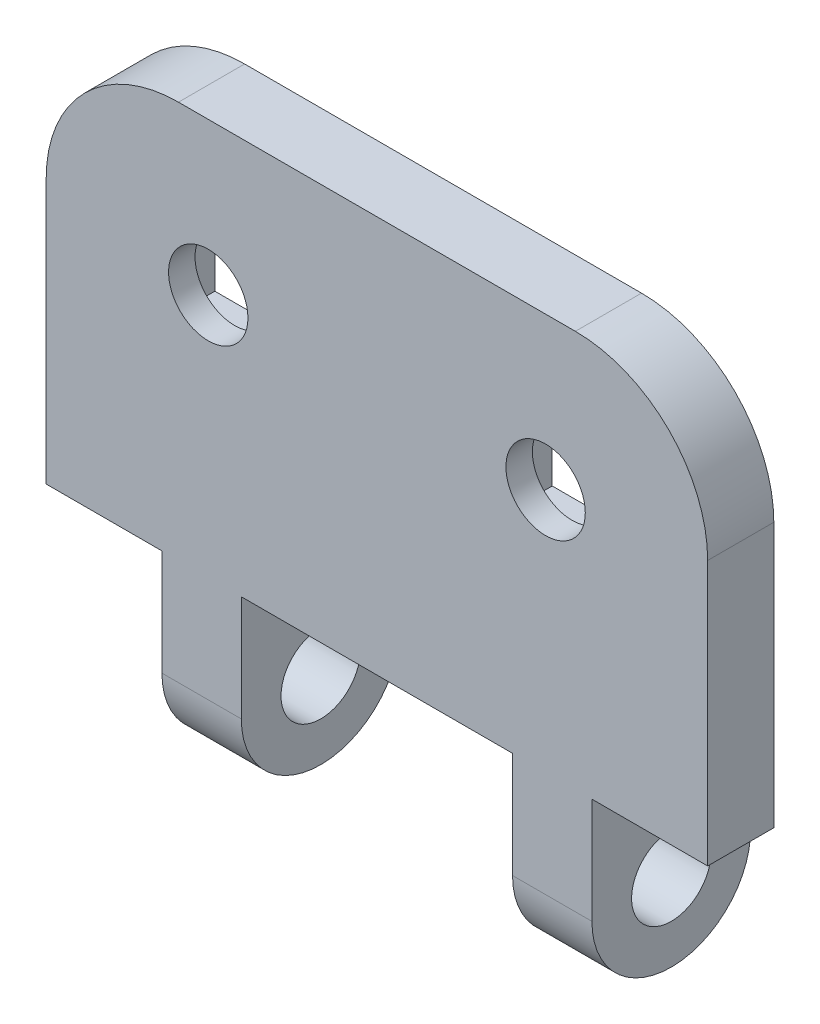
ISO-10303-21;
HEADER;
FILE_DESCRIPTION(('STEP AP214'),'2;1');
FILE_NAME('part.step','',(''),(''),'','','');
FILE_SCHEMA(('AUTOMOTIVE_DESIGN { 1 0 10303 214 1 1 1 1 }'));
ENDSEC;
DATA;
#1=APPLICATION_CONTEXT('core data for automotive mechanical design processes');
#2=APPLICATION_PROTOCOL_DEFINITION('international standard','automotive_design',2000,#1);
#3=PRODUCT_CONTEXT('',#1,'mechanical');
#4=PRODUCT('Part','Part','',(#3));
#5=PRODUCT_RELATED_PRODUCT_CATEGORY('part','',(#4));
#6=PRODUCT_DEFINITION_FORMATION('','',#4);
#7=PRODUCT_DEFINITION_CONTEXT('part definition',#1,'design');
#8=PRODUCT_DEFINITION('design','',#6,#7);
#9=PRODUCT_DEFINITION_SHAPE('','',#8);
#10=(LENGTH_UNIT() NAMED_UNIT(*) SI_UNIT(.MILLI.,.METRE.));
#11=(NAMED_UNIT(*) PLANE_ANGLE_UNIT() SI_UNIT($,.RADIAN.));
#12=(NAMED_UNIT(*) SI_UNIT($,.STERADIAN.) SOLID_ANGLE_UNIT());
#13=UNCERTAINTY_MEASURE_WITH_UNIT(LENGTH_MEASURE(1.E-05),#10,'distance_accuracy_value','');
#14=(GEOMETRIC_REPRESENTATION_CONTEXT(3) GLOBAL_UNCERTAINTY_ASSIGNED_CONTEXT((#13)) GLOBAL_UNIT_ASSIGNED_CONTEXT((#10,
#11,#12)) REPRESENTATION_CONTEXT('',''));
#15=CARTESIAN_POINT('',(0.,0.,0.));
#16=DIRECTION('',(0.,0.,1.));
#17=DIRECTION('',(1.,0.,0.));
#18=AXIS2_PLACEMENT_3D('',#15,#16,#17);
#19=CARTESIAN_POINT('',(15.,5.,0.));
#20=DIRECTION('',(0.,0.,-1.));
#21=DIRECTION('',(-1.,0.,0.));
#22=AXIS2_PLACEMENT_3D('',#19,#20,#21);
#23=PLANE('',#22);
#24=DIRECTION('',(0.,1.,0.));
#25=VECTOR('',#24,1.);
#26=CARTESIAN_POINT('',(-8.25,-1.,0.));
#27=LINE('',#26,#25);
#28=CARTESIAN_POINT('',(-8.25,-1.,0.));
#29=VERTEX_POINT('',#28);
#30=CARTESIAN_POINT('',(-8.25,8.,0.));
#31=VERTEX_POINT('',#30);
#32=EDGE_CURVE('E234',#29,#31,#27,.T.);
#33=ORIENTED_EDGE('',*,*,#32,.T.);
#34=DIRECTION('',(-1.,0.,0.));
#35=VECTOR('',#34,1.);
#36=CARTESIAN_POINT('',(-8.25,8.,0.));
#37=LINE('',#36,#35);
#38=CARTESIAN_POINT('',(-17.25,8.,0.));
#39=VERTEX_POINT('',#38);
#40=EDGE_CURVE('E58',#31,#39,#37,.T.);
#41=ORIENTED_EDGE('',*,*,#40,.T.);
#42=DIRECTION('',(0.,1.,0.));
#43=VECTOR('',#42,1.);
#44=CARTESIAN_POINT('',(-17.25,-1.,0.));
#45=LINE('',#44,#43);
#46=CARTESIAN_POINT('',(-17.25,-1.,0.));
#47=VERTEX_POINT('',#46);
#48=EDGE_CURVE('E241',#47,#39,#45,.T.);
#49=ORIENTED_EDGE('',*,*,#48,.F.);
#50=DIRECTION('',(-1.,0.,0.));
#51=VECTOR('',#50,1.);
#52=CARTESIAN_POINT('',(-8.25,-1.,0.));
#53=LINE('',#52,#51);
#54=EDGE_CURVE('E237',#29,#47,#53,.T.);
#55=ORIENTED_EDGE('',*,*,#54,.F.);
#56=EDGE_LOOP('',(#33,#41,#49,#55));
#57=FACE_BOUND('',#56,.T.);
#58=DIRECTION('',(1.,0.,0.));
#59=VECTOR('',#58,1.);
#60=CARTESIAN_POINT('',(-33.2205627484771,-17.0839202169004,0.));
#61=LINE('',#60,#59);
#62=CARTESIAN_POINT('',(-16.25,-17.0839202169004,0.));
#63=VERTEX_POINT('',#62);
#64=CARTESIAN_POINT('',(-10.25,-17.0839202169004,0.));
#65=VERTEX_POINT('',#64);
#66=EDGE_CURVE('E283',#63,#65,#61,.T.);
#67=ORIENTED_EDGE('',*,*,#66,.F.);
#68=DIRECTION('',(0.,-1.,0.));
#69=VECTOR('',#68,1.);
#70=CARTESIAN_POINT('',(-16.25,0.,0.));
#71=LINE('',#70,#69);
#72=CARTESIAN_POINT('',(-16.25,-15.,0.));
#73=VERTEX_POINT('',#72);
#74=EDGE_CURVE('E310',#73,#63,#71,.T.);
#75=ORIENTED_EDGE('',*,*,#74,.F.);
#76=DIRECTION('',(1.,0.,0.));
#77=VECTOR('',#76,1.);
#78=CARTESIAN_POINT('',(25.,-15.,0.));
#79=LINE('',#78,#77);
#80=CARTESIAN_POINT('',(-25.,-15.,0.));
#81=VERTEX_POINT('',#80);
#82=EDGE_CURVE('E340',#81,#73,#79,.T.);
#83=ORIENTED_EDGE('',*,*,#82,.F.);
#84=DIRECTION('',(0.,-1.,0.));
#85=VECTOR('',#84,1.);
#86=CARTESIAN_POINT('',(-25.,4.99999999999992,0.));
#87=LINE('',#86,#85);
#88=CARTESIAN_POINT('',(-25.,4.99999999999992,0.));
#89=VERTEX_POINT('',#88);
#90=EDGE_CURVE('E318',#89,#81,#87,.T.);
#91=ORIENTED_EDGE('',*,*,#90,.F.);
#92=CARTESIAN_POINT('',(-15.,5.,0.));
#93=DIRECTION('',(0.,0.,1.));
#94=DIRECTION('',(1.,0.,0.));
#95=AXIS2_PLACEMENT_3D('',#92,#93,#94);
#96=CIRCLE('',#95,10.);
#97=CARTESIAN_POINT('',(-14.9999999999999,15.,0.));
#98=VERTEX_POINT('',#97);
#99=EDGE_CURVE('E323',#98,#89,#96,.T.);
#100=ORIENTED_EDGE('',*,*,#99,.F.);
#101=DIRECTION('',(-1.,0.,0.));
#102=VECTOR('',#101,1.);
#103=CARTESIAN_POINT('',(14.9999999999999,15.,0.));
#104=LINE('',#103,#102);
#105=CARTESIAN_POINT('',(14.9999999999999,15.,0.));
#106=VERTEX_POINT('',#105);
#107=EDGE_CURVE('E347',#106,#98,#104,.T.);
#108=ORIENTED_EDGE('',*,*,#107,.F.);
#109=CARTESIAN_POINT('',(15.,5.,0.));
#110=DIRECTION('',(0.,0.,1.));
#111=DIRECTION('',(-1.,0.,0.));
#112=AXIS2_PLACEMENT_3D('',#109,#110,#111);
#113=CIRCLE('',#112,10.);
#114=CARTESIAN_POINT('',(25.,4.99999999999993,0.));
#115=VERTEX_POINT('',#114);
#116=EDGE_CURVE('E345',#115,#106,#113,.T.);
#117=ORIENTED_EDGE('',*,*,#116,.F.);
#118=DIRECTION('',(0.,1.,0.));
#119=VECTOR('',#118,1.);
#120=CARTESIAN_POINT('',(25.,4.99999999999993,0.));
#121=LINE('',#120,#119);
#122=CARTESIAN_POINT('',(25.,-15.,0.));
#123=VERTEX_POINT('',#122);
#124=EDGE_CURVE('E342',#123,#115,#121,.T.);
#125=ORIENTED_EDGE('',*,*,#124,.F.);
#126=CARTESIAN_POINT('',(16.25,-15.,0.));
#127=VERTEX_POINT('',#126);
#128=EDGE_CURVE('E339',#127,#123,#79,.T.);
#129=ORIENTED_EDGE('',*,*,#128,.F.);
#130=DIRECTION('',(0.,-1.,0.));
#131=VECTOR('',#130,1.);
#132=CARTESIAN_POINT('',(16.25,0.,0.));
#133=LINE('',#132,#131);
#134=CARTESIAN_POINT('',(16.25,-17.0839202169004,0.));
#135=VERTEX_POINT('',#134);
#136=EDGE_CURVE('E287',#127,#135,#133,.T.);
#137=ORIENTED_EDGE('',*,*,#136,.T.);
#138=CARTESIAN_POINT('',(10.25,-17.0839202169004,0.));
#139=VERTEX_POINT('',#138);
#140=EDGE_CURVE('E279',#139,#135,#61,.T.);
#141=ORIENTED_EDGE('',*,*,#140,.F.);
#142=DIRECTION('',(0.,-1.,0.));
#143=VECTOR('',#142,1.);
#144=CARTESIAN_POINT('',(10.25,0.,0.));
#145=LINE('',#144,#143);
#146=CARTESIAN_POINT('',(10.25,-15.,0.));
#147=VERTEX_POINT('',#146);
#148=EDGE_CURVE('E292',#147,#139,#145,.T.);
#149=ORIENTED_EDGE('',*,*,#148,.F.);
#150=CARTESIAN_POINT('',(-10.25,-15.,0.));
#151=VERTEX_POINT('',#150);
#152=EDGE_CURVE('E343',#151,#147,#79,.T.);
#153=ORIENTED_EDGE('',*,*,#152,.F.);
#154=DIRECTION('',(0.,-1.,0.));
#155=VECTOR('',#154,1.);
#156=CARTESIAN_POINT('',(-10.25,0.,0.));
#157=LINE('',#156,#155);
#158=EDGE_CURVE('E298',#151,#65,#157,.T.);
#159=ORIENTED_EDGE('',*,*,#158,.T.);
#160=EDGE_LOOP('',(#67,#75,#83,#91,#100,#108,#117,#125,#129,#137,#141,#149,#153,#159));
#161=FACE_BOUND('',#160,.T.);
#162=DIRECTION('',(0.,1.,0.));
#163=VECTOR('',#162,1.);
#164=CARTESIAN_POINT('',(17.25,-0.999999999999994,0.));
#165=LINE('',#164,#163);
#166=CARTESIAN_POINT('',(17.25,-0.999999999999994,0.));
#167=VERTEX_POINT('',#166);
#168=CARTESIAN_POINT('',(17.25,8.00000000000001,0.));
#169=VERTEX_POINT('',#168);
#170=EDGE_CURVE('E194',#167,#169,#165,.T.);
#171=ORIENTED_EDGE('',*,*,#170,.T.);
#172=DIRECTION('',(-1.,0.,0.));
#173=VECTOR('',#172,1.);
#174=CARTESIAN_POINT('',(17.25,8.00000000000001,0.));
#175=LINE('',#174,#173);
#176=CARTESIAN_POINT('',(8.25,8.00000000000001,0.));
#177=VERTEX_POINT('',#176);
#178=EDGE_CURVE('E50',#169,#177,#175,.T.);
#179=ORIENTED_EDGE('',*,*,#178,.T.);
#180=DIRECTION('',(0.,1.,0.));
#181=VECTOR('',#180,1.);
#182=CARTESIAN_POINT('',(8.25,-0.999999999999994,0.));
#183=LINE('',#182,#181);
#184=CARTESIAN_POINT('',(8.25,-0.999999999999994,0.));
#185=VERTEX_POINT('',#184);
#186=EDGE_CURVE('E201',#185,#177,#183,.T.);
#187=ORIENTED_EDGE('',*,*,#186,.F.);
#188=DIRECTION('',(-1.,0.,0.));
#189=VECTOR('',#188,1.);
#190=CARTESIAN_POINT('',(17.25,-0.999999999999994,0.));
#191=LINE('',#190,#189);
#192=EDGE_CURVE('E216',#167,#185,#191,.T.);
#193=ORIENTED_EDGE('',*,*,#192,.F.);
#194=EDGE_LOOP('',(#171,#179,#187,#193));
#195=FACE_BOUND('',#194,.T.);
#196=ADVANCED_FACE('F33',(#57,#161,#195),#23,.T.);
#197=CARTESIAN_POINT('',(12.75,3.50000000000001,-1.));
#198=DIRECTION('',(0.,0.,1.));
#199=DIRECTION('',(1.,0.,0.));
#200=AXIS2_PLACEMENT_3D('',#197,#198,#199);
#201=CYLINDRICAL_SURFACE('',#200,3.);
#202=CARTESIAN_POINT('',(12.75,3.50000000000001,5.));
#203=DIRECTION('',(0.,0.,1.));
#204=DIRECTION('',(1.,0.,0.));
#205=AXIS2_PLACEMENT_3D('',#202,#203,#204);
#206=CIRCLE('',#205,3.);
#207=CARTESIAN_POINT('',(15.75,3.50000000000001,5.));
#208=VERTEX_POINT('',#207);
#209=EDGE_CURVE('E257',#208,#208,#206,.T.);
#210=ORIENTED_EDGE('',*,*,#209,.T.);
#211=EDGE_LOOP('',(#210));
#212=FACE_BOUND('',#211,.T.);
#213=CARTESIAN_POINT('',(12.75,3.50000000000001,3.));
#214=DIRECTION('',(0.,0.,-1.));
#215=DIRECTION('',(-1.,0.,0.));
#216=AXIS2_PLACEMENT_3D('',#213,#214,#215);
#217=CIRCLE('',#216,3.);
#218=CARTESIAN_POINT('',(9.75,3.50000000000001,3.));
#219=VERTEX_POINT('',#218);
#220=EDGE_CURVE('E37',#219,#219,#217,.F.);
#221=ORIENTED_EDGE('',*,*,#220,.F.);
#222=EDGE_LOOP('',(#221));
#223=FACE_BOUND('',#222,.T.);
#224=ADVANCED_FACE('F372',(#212,#223),#201,.F.);
#225=CARTESIAN_POINT('',(-12.75,3.5,-1.));
#226=DIRECTION('',(0.,0.,1.));
#227=DIRECTION('',(1.,0.,0.));
#228=AXIS2_PLACEMENT_3D('',#225,#226,#227);
#229=CYLINDRICAL_SURFACE('',#228,3.);
#230=CARTESIAN_POINT('',(-12.75,3.5,5.));
#231=DIRECTION('',(0.,0.,1.));
#232=DIRECTION('',(1.,0.,0.));
#233=AXIS2_PLACEMENT_3D('',#230,#231,#232);
#234=CIRCLE('',#233,3.);
#235=CARTESIAN_POINT('',(-9.75,3.5,5.));
#236=VERTEX_POINT('',#235);
#237=EDGE_CURVE('E253',#236,#236,#234,.T.);
#238=ORIENTED_EDGE('',*,*,#237,.T.);
#239=EDGE_LOOP('',(#238));
#240=FACE_BOUND('',#239,.T.);
#241=CARTESIAN_POINT('',(-12.75,3.5,3.));
#242=DIRECTION('',(0.,0.,-1.));
#243=DIRECTION('',(-1.,0.,0.));
#244=AXIS2_PLACEMENT_3D('',#241,#242,#243);
#245=CIRCLE('',#244,3.);
#246=CARTESIAN_POINT('',(-15.75,3.5,3.));
#247=VERTEX_POINT('',#246);
#248=EDGE_CURVE('E202',#247,#247,#245,.F.);
#249=ORIENTED_EDGE('',*,*,#248,.F.);
#250=EDGE_LOOP('',(#249));
#251=FACE_BOUND('',#250,.T.);
#252=ADVANCED_FACE('F374',(#240,#251),#229,.F.);
#253=CARTESIAN_POINT('',(-33.2205627484771,-23.,-1.));
#254=DIRECTION('',(1.,0.,0.));
#255=DIRECTION('',(0.,0.,-1.));
#256=AXIS2_PLACEMENT_3D('',#253,#254,#255);
#257=CYLINDRICAL_SURFACE('',#256,6.);
#258=CARTESIAN_POINT('',(-10.25,-23.,-1.));
#259=DIRECTION('',(-1.,0.,0.));
#260=DIRECTION('',(0.,0.,1.));
#261=AXIS2_PLACEMENT_3D('',#258,#259,#260);
#262=CIRCLE('',#261,6.);
#263=CARTESIAN_POINT('',(-10.25,-23.,5.));
#264=VERTEX_POINT('',#263);
#265=EDGE_CURVE('E263',#264,#65,#262,.F.);
#266=ORIENTED_EDGE('',*,*,#265,.F.);
#267=DIRECTION('',(-1.,0.,0.));
#268=VECTOR('',#267,1.);
#269=CARTESIAN_POINT('',(25.,-23.,5.));
#270=LINE('',#269,#268);
#271=CARTESIAN_POINT('',(-16.25,-23.,5.));
#272=VERTEX_POINT('',#271);
#273=EDGE_CURVE('E265',#264,#272,#270,.T.);
#274=ORIENTED_EDGE('',*,*,#273,.T.);
#275=CARTESIAN_POINT('',(-16.25,-23.,-1.));
#276=DIRECTION('',(-1.,0.,0.));
#277=DIRECTION('',(0.,-1.,0.));
#278=AXIS2_PLACEMENT_3D('',#275,#276,#277);
#279=CIRCLE('',#278,6.);
#280=EDGE_CURVE('E276',#272,#63,#279,.F.);
#281=ORIENTED_EDGE('',*,*,#280,.T.);
#282=ORIENTED_EDGE('',*,*,#66,.T.);
#283=EDGE_LOOP('',(#266,#274,#281,#282));
#284=FACE_BOUND('',#283,.T.);
#285=ADVANCED_FACE('F381',(#284),#257,.T.);
#286=CARTESIAN_POINT('',(16.25,-23.,5.));
#287=VERTEX_POINT('',#286);
#288=CARTESIAN_POINT('',(10.25,-23.,5.));
#289=VERTEX_POINT('',#288);
#290=EDGE_CURVE('E268',#287,#289,#270,.T.);
#291=ORIENTED_EDGE('',*,*,#290,.T.);
#292=CARTESIAN_POINT('',(10.25,-23.,-1.));
#293=DIRECTION('',(1.,0.,0.));
#294=DIRECTION('',(0.,0.,-1.));
#295=AXIS2_PLACEMENT_3D('',#292,#293,#294);
#296=CIRCLE('',#295,6.);
#297=EDGE_CURVE('E260',#139,#289,#296,.F.);
#298=ORIENTED_EDGE('',*,*,#297,.F.);
#299=ORIENTED_EDGE('',*,*,#140,.T.);
#300=CARTESIAN_POINT('',(16.25,-23.,-1.));
#301=DIRECTION('',(1.,0.,0.));
#302=DIRECTION('',(0.,0.,-1.));
#303=AXIS2_PLACEMENT_3D('',#300,#301,#302);
#304=CIRCLE('',#303,6.);
#305=EDGE_CURVE('E269',#287,#135,#304,.T.);
#306=ORIENTED_EDGE('',*,*,#305,.F.);
#307=EDGE_LOOP('',(#291,#298,#299,#306));
#308=FACE_BOUND('',#307,.T.);
#309=ADVANCED_FACE('F390',(#308),#257,.T.);
#310=CARTESIAN_POINT('',(-33.2205627484771,-23.,-1.));
#311=DIRECTION('',(1.,0.,0.));
#312=DIRECTION('',(0.,0.,-1.));
#313=AXIS2_PLACEMENT_3D('',#310,#311,#312);
#314=CYLINDRICAL_SURFACE('',#313,3.);
#315=CARTESIAN_POINT('',(-10.25,-23.,-1.));
#316=DIRECTION('',(-1.,0.,0.));
#317=DIRECTION('',(0.,0.,1.));
#318=AXIS2_PLACEMENT_3D('',#315,#316,#317);
#319=CIRCLE('',#318,3.);
#320=CARTESIAN_POINT('',(-10.25,-23.,2.));
#321=VERTEX_POINT('',#320);
#322=EDGE_CURVE('E262',#321,#321,#319,.F.);
#323=ORIENTED_EDGE('',*,*,#322,.T.);
#324=EDGE_LOOP('',(#323));
#325=FACE_BOUND('',#324,.T.);
#326=CARTESIAN_POINT('',(-16.25,-23.,-1.));
#327=DIRECTION('',(-1.,0.,0.));
#328=DIRECTION('',(0.,-1.,0.));
#329=AXIS2_PLACEMENT_3D('',#326,#327,#328);
#330=CIRCLE('',#329,3.);
#331=CARTESIAN_POINT('',(-16.25,-26.,-1.));
#332=VERTEX_POINT('',#331);
#333=EDGE_CURVE('E272',#332,#332,#330,.F.);
#334=ORIENTED_EDGE('',*,*,#333,.F.);
#335=EDGE_LOOP('',(#334));
#336=FACE_BOUND('',#335,.T.);
#337=ADVANCED_FACE('F398',(#325,#336),#314,.F.);
#338=CARTESIAN_POINT('',(15.,5.,5.));
#339=DIRECTION('',(0.,0.,-1.));
#340=DIRECTION('',(-1.,0.,0.));
#341=AXIS2_PLACEMENT_3D('',#338,#339,#340);
#342=PLANE('',#341);
#343=ORIENTED_EDGE('',*,*,#237,.F.);
#344=EDGE_LOOP('',(#343));
#345=FACE_BOUND('',#344,.T.);
#346=ORIENTED_EDGE('',*,*,#209,.F.);
#347=EDGE_LOOP('',(#346));
#348=FACE_BOUND('',#347,.T.);
#349=ORIENTED_EDGE('',*,*,#290,.F.);
#350=DIRECTION('',(0.,-1.,0.));
#351=VECTOR('',#350,1.);
#352=CARTESIAN_POINT('',(16.25,0.,5.));
#353=LINE('',#352,#351);
#354=CARTESIAN_POINT('',(16.25,-15.,5.));
#355=VERTEX_POINT('',#354);
#356=EDGE_CURVE('E289',#355,#287,#353,.T.);
#357=ORIENTED_EDGE('',*,*,#356,.F.);
#358=DIRECTION('',(1.,0.,0.));
#359=VECTOR('',#358,1.);
#360=CARTESIAN_POINT('',(25.,-15.,5.));
#361=LINE('',#360,#359);
#362=CARTESIAN_POINT('',(25.,-15.,5.));
#363=VERTEX_POINT('',#362);
#364=EDGE_CURVE('E322',#355,#363,#361,.T.);
#365=ORIENTED_EDGE('',*,*,#364,.T.);
#366=DIRECTION('',(0.,1.,0.));
#367=VECTOR('',#366,1.);
#368=CARTESIAN_POINT('',(25.,4.99999999999993,5.));
#369=LINE('',#368,#367);
#370=CARTESIAN_POINT('',(25.,4.99999999999993,5.));
#371=VERTEX_POINT('',#370);
#372=EDGE_CURVE('E327',#363,#371,#369,.T.);
#373=ORIENTED_EDGE('',*,*,#372,.T.);
#374=CARTESIAN_POINT('',(15.,5.,5.));
#375=DIRECTION('',(0.,0.,1.));
#376=DIRECTION('',(-1.,0.,0.));
#377=AXIS2_PLACEMENT_3D('',#374,#375,#376);
#378=CIRCLE('',#377,10.);
#379=CARTESIAN_POINT('',(14.9999999999999,15.,5.));
#380=VERTEX_POINT('',#379);
#381=EDGE_CURVE('E330',#371,#380,#378,.T.);
#382=ORIENTED_EDGE('',*,*,#381,.T.);
#383=DIRECTION('',(-1.,0.,0.));
#384=VECTOR('',#383,1.);
#385=CARTESIAN_POINT('',(14.9999999999999,15.,5.));
#386=LINE('',#385,#384);
#387=CARTESIAN_POINT('',(-14.9999999999999,15.,5.));
#388=VERTEX_POINT('',#387);
#389=EDGE_CURVE('E332',#380,#388,#386,.T.);
#390=ORIENTED_EDGE('',*,*,#389,.T.);
#391=CARTESIAN_POINT('',(-15.,5.,5.));
#392=DIRECTION('',(0.,0.,1.));
#393=DIRECTION('',(1.,0.,0.));
#394=AXIS2_PLACEMENT_3D('',#391,#392,#393);
#395=CIRCLE('',#394,10.);
#396=CARTESIAN_POINT('',(-25.,4.99999999999992,5.));
#397=VERTEX_POINT('',#396);
#398=EDGE_CURVE('E334',#388,#397,#395,.T.);
#399=ORIENTED_EDGE('',*,*,#398,.T.);
#400=DIRECTION('',(0.,-1.,0.));
#401=VECTOR('',#400,1.);
#402=CARTESIAN_POINT('',(-25.,4.99999999999992,5.));
#403=LINE('',#402,#401);
#404=CARTESIAN_POINT('',(-25.,-15.,5.));
#405=VERTEX_POINT('',#404);
#406=EDGE_CURVE('E319',#397,#405,#403,.T.);
#407=ORIENTED_EDGE('',*,*,#406,.T.);
#408=CARTESIAN_POINT('',(-16.25,-15.,5.));
#409=VERTEX_POINT('',#408);
#410=EDGE_CURVE('E324',#405,#409,#361,.T.);
#411=ORIENTED_EDGE('',*,*,#410,.T.);
#412=DIRECTION('',(0.,-1.,0.));
#413=VECTOR('',#412,1.);
#414=CARTESIAN_POINT('',(-16.25,0.,5.));
#415=LINE('',#414,#413);
#416=EDGE_CURVE('E307',#409,#272,#415,.T.);
#417=ORIENTED_EDGE('',*,*,#416,.T.);
#418=ORIENTED_EDGE('',*,*,#273,.F.);
#419=DIRECTION('',(0.,-1.,0.));
#420=VECTOR('',#419,1.);
#421=CARTESIAN_POINT('',(-10.25,0.,5.));
#422=LINE('',#421,#420);
#423=CARTESIAN_POINT('',(-10.25,-15.,5.));
#424=VERTEX_POINT('',#423);
#425=EDGE_CURVE('E302',#424,#264,#422,.T.);
#426=ORIENTED_EDGE('',*,*,#425,.F.);
#427=CARTESIAN_POINT('',(10.25,-15.,5.));
#428=VERTEX_POINT('',#427);
#429=EDGE_CURVE('E328',#424,#428,#361,.T.);
#430=ORIENTED_EDGE('',*,*,#429,.T.);
#431=DIRECTION('',(0.,-1.,0.));
#432=VECTOR('',#431,1.);
#433=CARTESIAN_POINT('',(10.25,0.,5.));
#434=LINE('',#433,#432);
#435=EDGE_CURVE('E284',#428,#289,#434,.T.);
#436=ORIENTED_EDGE('',*,*,#435,.T.);
#437=EDGE_LOOP('',(#349,#357,#365,#373,#382,#390,#399,#407,#411,#417,#418,#426,#430,#436));
#438=FACE_BOUND('',#437,.T.);
#439=ADVANCED_FACE('F415',(#345,#348,#438),#342,.F.);
#440=CARTESIAN_POINT('',(-16.25,0.,-14.3178210632764));
#441=DIRECTION('',(-1.,0.,0.));
#442=DIRECTION('',(0.,-1.,0.));
#443=AXIS2_PLACEMENT_3D('',#440,#441,#442);
#444=PLANE('',#443);
#445=ORIENTED_EDGE('',*,*,#280,.F.);
#446=ORIENTED_EDGE('',*,*,#416,.F.);
#447=DIRECTION('',(0.,0.,1.));
#448=VECTOR('',#447,1.);
#449=CARTESIAN_POINT('',(-16.25,-15.,-14.3178210632764));
#450=LINE('',#449,#448);
#451=EDGE_CURVE('E305',#73,#409,#450,.T.);
#452=ORIENTED_EDGE('',*,*,#451,.F.);
#453=ORIENTED_EDGE('',*,*,#74,.T.);
#454=EDGE_LOOP('',(#445,#446,#452,#453));
#455=FACE_BOUND('',#454,.T.);
#456=ORIENTED_EDGE('',*,*,#333,.T.);
#457=EDGE_LOOP('',(#456));
#458=FACE_BOUND('',#457,.T.);
#459=ADVANCED_FACE('F407',(#455,#458),#444,.T.);
#460=CARTESIAN_POINT('',(16.25,0.,-14.3178210632764));
#461=DIRECTION('',(-1.,0.,0.));
#462=DIRECTION('',(0.,0.,1.));
#463=AXIS2_PLACEMENT_3D('',#460,#461,#462);
#464=PLANE('',#463);
#465=ORIENTED_EDGE('',*,*,#356,.T.);
#466=ORIENTED_EDGE('',*,*,#305,.T.);
#467=ORIENTED_EDGE('',*,*,#136,.F.);
#468=DIRECTION('',(0.,0.,1.));
#469=VECTOR('',#468,1.);
#470=CARTESIAN_POINT('',(16.25,-15.,-14.3178210632764));
#471=LINE('',#470,#469);
#472=EDGE_CURVE('E293',#127,#355,#471,.T.);
#473=ORIENTED_EDGE('',*,*,#472,.T.);
#474=EDGE_LOOP('',(#465,#466,#467,#473));
#475=FACE_BOUND('',#474,.T.);
#476=CARTESIAN_POINT('',(16.25,-23.,-1.));
#477=DIRECTION('',(1.,0.,0.));
#478=DIRECTION('',(0.,0.,-1.));
#479=AXIS2_PLACEMENT_3D('',#476,#477,#478);
#480=CIRCLE('',#479,3.);
#481=CARTESIAN_POINT('',(16.25,-23.,-4.));
#482=VERTEX_POINT('',#481);
#483=EDGE_CURVE('E273',#482,#482,#480,.T.);
#484=ORIENTED_EDGE('',*,*,#483,.F.);
#485=EDGE_LOOP('',(#484));
#486=FACE_BOUND('',#485,.T.);
#487=ADVANCED_FACE('F403',(#475,#486),#464,.F.);
#488=CARTESIAN_POINT('',(10.25,0.,-14.3178210632764));
#489=DIRECTION('',(-1.,0.,0.));
#490=DIRECTION('',(0.,0.,1.));
#491=AXIS2_PLACEMENT_3D('',#488,#489,#490);
#492=PLANE('',#491);
#493=ORIENTED_EDGE('',*,*,#148,.T.);
#494=ORIENTED_EDGE('',*,*,#297,.T.);
#495=ORIENTED_EDGE('',*,*,#435,.F.);
#496=DIRECTION('',(0.,0.,1.));
#497=VECTOR('',#496,1.);
#498=CARTESIAN_POINT('',(10.25,-15.,-14.3178210632764));
#499=LINE('',#498,#497);
#500=EDGE_CURVE('E288',#147,#428,#499,.T.);
#501=ORIENTED_EDGE('',*,*,#500,.F.);
#502=EDGE_LOOP('',(#493,#494,#495,#501));
#503=FACE_BOUND('',#502,.T.);
#504=CARTESIAN_POINT('',(10.25,-23.,-1.));
#505=DIRECTION('',(1.,0.,0.));
#506=DIRECTION('',(0.,0.,-1.));
#507=AXIS2_PLACEMENT_3D('',#504,#505,#506);
#508=CIRCLE('',#507,3.);
#509=CARTESIAN_POINT('',(10.25,-23.,-4.));
#510=VERTEX_POINT('',#509);
#511=EDGE_CURVE('E256',#510,#510,#508,.F.);
#512=ORIENTED_EDGE('',*,*,#511,.F.);
#513=EDGE_LOOP('',(#512));
#514=FACE_BOUND('',#513,.T.);
#515=ADVANCED_FACE('F399',(#503,#514),#492,.T.);
#516=CARTESIAN_POINT('',(25.,-15.,5.));
#517=DIRECTION('',(0.,1.,0.));
#518=DIRECTION('',(-1.,0.,0.));
#519=AXIS2_PLACEMENT_3D('',#516,#517,#518);
#520=PLANE('',#519);
#521=ORIENTED_EDGE('',*,*,#472,.F.);
#522=ORIENTED_EDGE('',*,*,#128,.T.);
#523=DIRECTION('',(0.,0.,-1.));
#524=VECTOR('',#523,1.);
#525=CARTESIAN_POINT('',(25.,-15.,5.));
#526=LINE('',#525,#524);
#527=EDGE_CURVE('E42',#363,#123,#526,.T.);
#528=ORIENTED_EDGE('',*,*,#527,.F.);
#529=ORIENTED_EDGE('',*,*,#364,.F.);
#530=EDGE_LOOP('',(#521,#522,#528,#529));
#531=FACE_BOUND('',#530,.T.);
#532=ADVANCED_FACE('F402',(#531),#520,.F.);
#533=ORIENTED_EDGE('',*,*,#152,.T.);
#534=ORIENTED_EDGE('',*,*,#500,.T.);
#535=ORIENTED_EDGE('',*,*,#429,.F.);
#536=DIRECTION('',(0.,0.,1.));
#537=VECTOR('',#536,1.);
#538=CARTESIAN_POINT('',(-10.25,-15.,-14.3178210632764));
#539=LINE('',#538,#537);
#540=EDGE_CURVE('E306',#151,#424,#539,.T.);
#541=ORIENTED_EDGE('',*,*,#540,.F.);
#542=EDGE_LOOP('',(#533,#534,#535,#541));
#543=FACE_BOUND('',#542,.T.);
#544=ADVANCED_FACE('F437',(#543),#520,.F.);
#545=CARTESIAN_POINT('',(-25.,4.99999999999992,5.));
#546=DIRECTION('',(1.,0.,0.));
#547=DIRECTION('',(0.,1.,0.));
#548=AXIS2_PLACEMENT_3D('',#545,#546,#547);
#549=PLANE('',#548);
#550=ORIENTED_EDGE('',*,*,#90,.T.);
#551=DIRECTION('',(0.,0.,-1.));
#552=VECTOR('',#551,1.);
#553=CARTESIAN_POINT('',(-25.,-15.,5.));
#554=LINE('',#553,#552);
#555=EDGE_CURVE('E11',#405,#81,#554,.T.);
#556=ORIENTED_EDGE('',*,*,#555,.F.);
#557=ORIENTED_EDGE('',*,*,#406,.F.);
#558=DIRECTION('',(0.,0.,-1.));
#559=VECTOR('',#558,1.);
#560=CARTESIAN_POINT('',(-25.,4.99999999999992,5.));
#561=LINE('',#560,#559);
#562=EDGE_CURVE('E336',#397,#89,#561,.T.);
#563=ORIENTED_EDGE('',*,*,#562,.T.);
#564=EDGE_LOOP('',(#550,#556,#557,#563));
#565=FACE_BOUND('',#564,.T.);
#566=ADVANCED_FACE('F35',(#565),#549,.F.);
#567=ORIENTED_EDGE('',*,*,#82,.T.);
#568=ORIENTED_EDGE('',*,*,#451,.T.);
#569=ORIENTED_EDGE('',*,*,#410,.F.);
#570=ORIENTED_EDGE('',*,*,#555,.T.);
#571=EDGE_LOOP('',(#567,#568,#569,#570));
#572=FACE_BOUND('',#571,.T.);
#573=ADVANCED_FACE('F433',(#572),#520,.F.);
#574=CARTESIAN_POINT('',(25.,4.99999999999993,5.));
#575=DIRECTION('',(-1.,0.,0.));
#576=DIRECTION('',(0.,-1.,0.));
#577=AXIS2_PLACEMENT_3D('',#574,#575,#576);
#578=PLANE('',#577);
#579=ORIENTED_EDGE('',*,*,#124,.T.);
#580=DIRECTION('',(0.,0.,-1.));
#581=VECTOR('',#580,1.);
#582=CARTESIAN_POINT('',(25.,4.99999999999993,5.));
#583=LINE('',#582,#581);
#584=EDGE_CURVE('E358',#371,#115,#583,.T.);
#585=ORIENTED_EDGE('',*,*,#584,.F.);
#586=ORIENTED_EDGE('',*,*,#372,.F.);
#587=ORIENTED_EDGE('',*,*,#527,.T.);
#588=EDGE_LOOP('',(#579,#585,#586,#587));
#589=FACE_BOUND('',#588,.T.);
#590=ADVANCED_FACE('F430',(#589),#578,.F.);
#591=CARTESIAN_POINT('',(15.,5.,5.));
#592=DIRECTION('',(0.,0.,-1.));
#593=DIRECTION('',(-1.,0.,0.));
#594=AXIS2_PLACEMENT_3D('',#591,#592,#593);
#595=CYLINDRICAL_SURFACE('',#594,10.);
#596=ORIENTED_EDGE('',*,*,#116,.T.);
#597=DIRECTION('',(0.,0.,-1.));
#598=VECTOR('',#597,1.);
#599=CARTESIAN_POINT('',(14.9999999999999,15.,5.));
#600=LINE('',#599,#598);
#601=EDGE_CURVE('E355',#380,#106,#600,.T.);
#602=ORIENTED_EDGE('',*,*,#601,.F.);
#603=ORIENTED_EDGE('',*,*,#381,.F.);
#604=ORIENTED_EDGE('',*,*,#584,.T.);
#605=EDGE_LOOP('',(#596,#602,#603,#604));
#606=FACE_BOUND('',#605,.T.);
#607=ADVANCED_FACE('F426',(#606),#595,.T.);
#608=CARTESIAN_POINT('',(14.9999999999999,15.,5.));
#609=DIRECTION('',(0.,-1.,0.));
#610=DIRECTION('',(1.,0.,0.));
#611=AXIS2_PLACEMENT_3D('',#608,#609,#610);
#612=PLANE('',#611);
#613=ORIENTED_EDGE('',*,*,#107,.T.);
#614=DIRECTION('',(0.,0.,-1.));
#615=VECTOR('',#614,1.);
#616=CARTESIAN_POINT('',(-14.9999999999999,15.,5.));
#617=LINE('',#616,#615);
#618=EDGE_CURVE('E352',#388,#98,#617,.T.);
#619=ORIENTED_EDGE('',*,*,#618,.F.);
#620=ORIENTED_EDGE('',*,*,#389,.F.);
#621=ORIENTED_EDGE('',*,*,#601,.T.);
#622=EDGE_LOOP('',(#613,#619,#620,#621));
#623=FACE_BOUND('',#622,.T.);
#624=ADVANCED_FACE('F422',(#623),#612,.F.);
#625=CARTESIAN_POINT('',(-15.,5.,5.));
#626=DIRECTION('',(0.,0.,-1.));
#627=DIRECTION('',(-1.,0.,0.));
#628=AXIS2_PLACEMENT_3D('',#625,#626,#627);
#629=CYLINDRICAL_SURFACE('',#628,10.);
#630=ORIENTED_EDGE('',*,*,#99,.T.);
#631=ORIENTED_EDGE('',*,*,#562,.F.);
#632=ORIENTED_EDGE('',*,*,#398,.F.);
#633=ORIENTED_EDGE('',*,*,#618,.T.);
#634=EDGE_LOOP('',(#630,#631,#632,#633));
#635=FACE_BOUND('',#634,.T.);
#636=ADVANCED_FACE('F411',(#635),#629,.T.);
#637=CARTESIAN_POINT('',(-10.25,0.,-14.3178210632764));
#638=DIRECTION('',(-1.,0.,0.));
#639=DIRECTION('',(0.,-1.,0.));
#640=AXIS2_PLACEMENT_3D('',#637,#638,#639);
#641=PLANE('',#640);
#642=ORIENTED_EDGE('',*,*,#425,.T.);
#643=ORIENTED_EDGE('',*,*,#265,.T.);
#644=ORIENTED_EDGE('',*,*,#158,.F.);
#645=ORIENTED_EDGE('',*,*,#540,.T.);
#646=EDGE_LOOP('',(#642,#643,#644,#645));
#647=FACE_BOUND('',#646,.T.);
#648=ORIENTED_EDGE('',*,*,#322,.F.);
#649=EDGE_LOOP('',(#648));
#650=FACE_BOUND('',#649,.T.);
#651=ADVANCED_FACE('F396',(#647,#650),#641,.F.);
#652=ORIENTED_EDGE('',*,*,#511,.T.);
#653=EDGE_LOOP('',(#652));
#654=FACE_BOUND('',#653,.T.);
#655=ORIENTED_EDGE('',*,*,#483,.T.);
#656=EDGE_LOOP('',(#655));
#657=FACE_BOUND('',#656,.T.);
#658=ADVANCED_FACE('F392',(#654,#657),#314,.F.);
#659=CARTESIAN_POINT('',(0.,0.,3.));
#660=DIRECTION('',(0.,0.,-1.));
#661=DIRECTION('',(-1.,0.,0.));
#662=AXIS2_PLACEMENT_3D('',#659,#660,#661);
#663=PLANE('',#662);
#664=DIRECTION('',(-1.,0.,0.));
#665=VECTOR('',#664,1.);
#666=CARTESIAN_POINT('',(-8.25,8.,3.));
#667=LINE('',#666,#665);
#668=CARTESIAN_POINT('',(-8.25,8.,3.));
#669=VERTEX_POINT('',#668);
#670=CARTESIAN_POINT('',(-17.25,8.,3.));
#671=VERTEX_POINT('',#670);
#672=EDGE_CURVE('E238',#669,#671,#667,.T.);
#673=ORIENTED_EDGE('',*,*,#672,.F.);
#674=DIRECTION('',(0.,1.,0.));
#675=VECTOR('',#674,1.);
#676=CARTESIAN_POINT('',(-8.25,-1.,3.));
#677=LINE('',#676,#675);
#678=CARTESIAN_POINT('',(-8.25,-1.,3.));
#679=VERTEX_POINT('',#678);
#680=EDGE_CURVE('E233',#679,#669,#677,.T.);
#681=ORIENTED_EDGE('',*,*,#680,.F.);
#682=DIRECTION('',(-1.,0.,0.));
#683=VECTOR('',#682,1.);
#684=CARTESIAN_POINT('',(-8.25,-1.,3.));
#685=LINE('',#684,#683);
#686=CARTESIAN_POINT('',(-17.25,-1.,3.));
#687=VERTEX_POINT('',#686);
#688=EDGE_CURVE('E246',#679,#687,#685,.T.);
#689=ORIENTED_EDGE('',*,*,#688,.T.);
#690=DIRECTION('',(0.,1.,0.));
#691=VECTOR('',#690,1.);
#692=CARTESIAN_POINT('',(-17.25,-1.,3.));
#693=LINE('',#692,#691);
#694=EDGE_CURVE('E249',#687,#671,#693,.T.);
#695=ORIENTED_EDGE('',*,*,#694,.T.);
#696=EDGE_LOOP('',(#673,#681,#689,#695));
#697=FACE_BOUND('',#696,.T.);
#698=ORIENTED_EDGE('',*,*,#248,.T.);
#699=EDGE_LOOP('',(#698));
#700=FACE_BOUND('',#699,.T.);
#701=ADVANCED_FACE('F395',(#697,#700),#663,.T.);
#702=CARTESIAN_POINT('',(-8.25,8.,3.));
#703=DIRECTION('',(0.,-1.,0.));
#704=DIRECTION('',(0.,0.,-1.));
#705=AXIS2_PLACEMENT_3D('',#702,#703,#704);
#706=PLANE('',#705);
#707=ORIENTED_EDGE('',*,*,#40,.F.);
#708=DIRECTION('',(0.,0.,-1.));
#709=VECTOR('',#708,1.);
#710=CARTESIAN_POINT('',(-8.25,8.,3.));
#711=LINE('',#710,#709);
#712=EDGE_CURVE('E231',#669,#31,#711,.T.);
#713=ORIENTED_EDGE('',*,*,#712,.F.);
#714=ORIENTED_EDGE('',*,*,#672,.T.);
#715=DIRECTION('',(0.,0.,-1.));
#716=VECTOR('',#715,1.);
#717=CARTESIAN_POINT('',(-17.25,8.,3.));
#718=LINE('',#717,#716);
#719=EDGE_CURVE('E225',#671,#39,#718,.T.);
#720=ORIENTED_EDGE('',*,*,#719,.T.);
#721=EDGE_LOOP('',(#707,#713,#714,#720));
#722=FACE_BOUND('',#721,.T.);
#723=ADVANCED_FACE('F602',(#722),#706,.T.);
#724=CARTESIAN_POINT('',(-17.25,-1.,3.));
#725=DIRECTION('',(-1.,0.,0.));
#726=DIRECTION('',(0.,0.,1.));
#727=AXIS2_PLACEMENT_3D('',#724,#725,#726);
#728=PLANE('',#727);
#729=ORIENTED_EDGE('',*,*,#48,.T.);
#730=ORIENTED_EDGE('',*,*,#719,.F.);
#731=ORIENTED_EDGE('',*,*,#694,.F.);
#732=DIRECTION('',(0.,0.,-1.));
#733=VECTOR('',#732,1.);
#734=CARTESIAN_POINT('',(-17.25,-1.,3.));
#735=LINE('',#734,#733);
#736=EDGE_CURVE('E227',#687,#47,#735,.T.);
#737=ORIENTED_EDGE('',*,*,#736,.T.);
#738=EDGE_LOOP('',(#729,#730,#731,#737));
#739=FACE_BOUND('',#738,.T.);
#740=ADVANCED_FACE('F608',(#739),#728,.F.);
#741=CARTESIAN_POINT('',(-8.25,-1.,3.));
#742=DIRECTION('',(0.,-1.,0.));
#743=DIRECTION('',(0.,0.,-1.));
#744=AXIS2_PLACEMENT_3D('',#741,#742,#743);
#745=PLANE('',#744);
#746=ORIENTED_EDGE('',*,*,#54,.T.);
#747=ORIENTED_EDGE('',*,*,#736,.F.);
#748=ORIENTED_EDGE('',*,*,#688,.F.);
#749=DIRECTION('',(0.,0.,-1.));
#750=VECTOR('',#749,1.);
#751=CARTESIAN_POINT('',(-8.25,-1.,3.));
#752=LINE('',#751,#750);
#753=EDGE_CURVE('E229',#679,#29,#752,.T.);
#754=ORIENTED_EDGE('',*,*,#753,.T.);
#755=EDGE_LOOP('',(#746,#747,#748,#754));
#756=FACE_BOUND('',#755,.T.);
#757=ADVANCED_FACE('F615',(#756),#745,.F.);
#758=CARTESIAN_POINT('',(-8.25,-1.,3.));
#759=DIRECTION('',(-1.,0.,0.));
#760=DIRECTION('',(0.,0.,1.));
#761=AXIS2_PLACEMENT_3D('',#758,#759,#760);
#762=PLANE('',#761);
#763=ORIENTED_EDGE('',*,*,#32,.F.);
#764=ORIENTED_EDGE('',*,*,#753,.F.);
#765=ORIENTED_EDGE('',*,*,#680,.T.);
#766=ORIENTED_EDGE('',*,*,#712,.T.);
#767=EDGE_LOOP('',(#763,#764,#765,#766));
#768=FACE_BOUND('',#767,.T.);
#769=ADVANCED_FACE('F623',(#768),#762,.T.);
#770=CARTESIAN_POINT('',(0.,0.,3.));
#771=DIRECTION('',(0.,0.,-1.));
#772=DIRECTION('',(-1.,0.,0.));
#773=AXIS2_PLACEMENT_3D('',#770,#771,#772);
#774=PLANE('',#773);
#775=DIRECTION('',(-1.,0.,0.));
#776=VECTOR('',#775,1.);
#777=CARTESIAN_POINT('',(17.25,8.00000000000001,3.));
#778=LINE('',#777,#776);
#779=CARTESIAN_POINT('',(17.25,8.00000000000001,3.));
#780=VERTEX_POINT('',#779);
#781=CARTESIAN_POINT('',(8.25,8.00000000000001,3.));
#782=VERTEX_POINT('',#781);
#783=EDGE_CURVE('E184',#780,#782,#778,.T.);
#784=ORIENTED_EDGE('',*,*,#783,.F.);
#785=DIRECTION('',(0.,1.,0.));
#786=VECTOR('',#785,1.);
#787=CARTESIAN_POINT('',(17.25,-0.999999999999994,3.));
#788=LINE('',#787,#786);
#789=CARTESIAN_POINT('',(17.25,-0.999999999999994,3.));
#790=VERTEX_POINT('',#789);
#791=EDGE_CURVE('E210',#790,#780,#788,.T.);
#792=ORIENTED_EDGE('',*,*,#791,.F.);
#793=DIRECTION('',(-1.,0.,0.));
#794=VECTOR('',#793,1.);
#795=CARTESIAN_POINT('',(17.25,-0.999999999999994,3.));
#796=LINE('',#795,#794);
#797=CARTESIAN_POINT('',(8.25,-0.999999999999994,3.));
#798=VERTEX_POINT('',#797);
#799=EDGE_CURVE('E208',#790,#798,#796,.T.);
#800=ORIENTED_EDGE('',*,*,#799,.T.);
#801=DIRECTION('',(0.,1.,0.));
#802=VECTOR('',#801,1.);
#803=CARTESIAN_POINT('',(8.25,-0.999999999999994,3.));
#804=LINE('',#803,#802);
#805=EDGE_CURVE('E193',#798,#782,#804,.T.);
#806=ORIENTED_EDGE('',*,*,#805,.T.);
#807=EDGE_LOOP('',(#784,#792,#800,#806));
#808=FACE_BOUND('',#807,.T.);
#809=ORIENTED_EDGE('',*,*,#220,.T.);
#810=EDGE_LOOP('',(#809));
#811=FACE_BOUND('',#810,.T.);
#812=ADVANCED_FACE('F205',(#808,#811),#774,.T.);
#813=CARTESIAN_POINT('',(17.25,8.00000000000001,3.));
#814=DIRECTION('',(0.,-1.,0.));
#815=DIRECTION('',(0.,0.,-1.));
#816=AXIS2_PLACEMENT_3D('',#813,#814,#815);
#817=PLANE('',#816);
#818=ORIENTED_EDGE('',*,*,#178,.F.);
#819=DIRECTION('',(0.,0.,-1.));
#820=VECTOR('',#819,1.);
#821=CARTESIAN_POINT('',(17.25,8.00000000000001,3.));
#822=LINE('',#821,#820);
#823=EDGE_CURVE('E189',#780,#169,#822,.T.);
#824=ORIENTED_EDGE('',*,*,#823,.F.);
#825=ORIENTED_EDGE('',*,*,#783,.T.);
#826=DIRECTION('',(0.,0.,-1.));
#827=VECTOR('',#826,1.);
#828=CARTESIAN_POINT('',(8.25,8.00000000000001,3.));
#829=LINE('',#828,#827);
#830=EDGE_CURVE('E187',#782,#177,#829,.T.);
#831=ORIENTED_EDGE('',*,*,#830,.T.);
#832=EDGE_LOOP('',(#818,#824,#825,#831));
#833=FACE_BOUND('',#832,.T.);
#834=ADVANCED_FACE('F186',(#833),#817,.T.);
#835=CARTESIAN_POINT('',(8.25,-0.999999999999994,3.));
#836=DIRECTION('',(-1.,0.,0.));
#837=DIRECTION('',(0.,0.,1.));
#838=AXIS2_PLACEMENT_3D('',#835,#836,#837);
#839=PLANE('',#838);
#840=ORIENTED_EDGE('',*,*,#186,.T.);
#841=ORIENTED_EDGE('',*,*,#830,.F.);
#842=ORIENTED_EDGE('',*,*,#805,.F.);
#843=DIRECTION('',(0.,0.,-1.));
#844=VECTOR('',#843,1.);
#845=CARTESIAN_POINT('',(8.25,-0.999999999999994,3.));
#846=LINE('',#845,#844);
#847=EDGE_CURVE('E203',#798,#185,#846,.T.);
#848=ORIENTED_EDGE('',*,*,#847,.T.);
#849=EDGE_LOOP('',(#840,#841,#842,#848));
#850=FACE_BOUND('',#849,.T.);
#851=ADVANCED_FACE('F198',(#850),#839,.F.);
#852=CARTESIAN_POINT('',(17.25,-0.999999999999994,3.));
#853=DIRECTION('',(0.,-1.,0.));
#854=DIRECTION('',(0.,0.,-1.));
#855=AXIS2_PLACEMENT_3D('',#852,#853,#854);
#856=PLANE('',#855);
#857=ORIENTED_EDGE('',*,*,#192,.T.);
#858=ORIENTED_EDGE('',*,*,#847,.F.);
#859=ORIENTED_EDGE('',*,*,#799,.F.);
#860=DIRECTION('',(0.,0.,-1.));
#861=VECTOR('',#860,1.);
#862=CARTESIAN_POINT('',(17.25,-0.999999999999994,3.));
#863=LINE('',#862,#861);
#864=EDGE_CURVE('E222',#790,#167,#863,.T.);
#865=ORIENTED_EDGE('',*,*,#864,.T.);
#866=EDGE_LOOP('',(#857,#858,#859,#865));
#867=FACE_BOUND('',#866,.T.);
#868=ADVANCED_FACE('F650',(#867),#856,.F.);
#869=CARTESIAN_POINT('',(17.25,-0.999999999999994,3.));
#870=DIRECTION('',(-1.,0.,0.));
#871=DIRECTION('',(0.,0.,1.));
#872=AXIS2_PLACEMENT_3D('',#869,#870,#871);
#873=PLANE('',#872);
#874=ORIENTED_EDGE('',*,*,#170,.F.);
#875=ORIENTED_EDGE('',*,*,#864,.F.);
#876=ORIENTED_EDGE('',*,*,#791,.T.);
#877=ORIENTED_EDGE('',*,*,#823,.T.);
#878=EDGE_LOOP('',(#874,#875,#876,#877));
#879=FACE_BOUND('',#878,.T.);
#880=ADVANCED_FACE('F657',(#879),#873,.T.);
#881=CLOSED_SHELL('',(#196,#224,#252,#285,#309,#337,#439,#459,#487,#515,#532,#544,#566,#573,
#590,#607,#624,#636,#651,#658,#701,#723,#740,#757,#769,#812,#834,#851,#868,#880));
#882=MANIFOLD_SOLID_BREP('B2',#881);
#883=ADVANCED_BREP_SHAPE_REPRESENTATION('',(#18,#882),#14);
#884=SHAPE_DEFINITION_REPRESENTATION(#9,#883);
ENDSEC;
END-ISO-10303-21;
